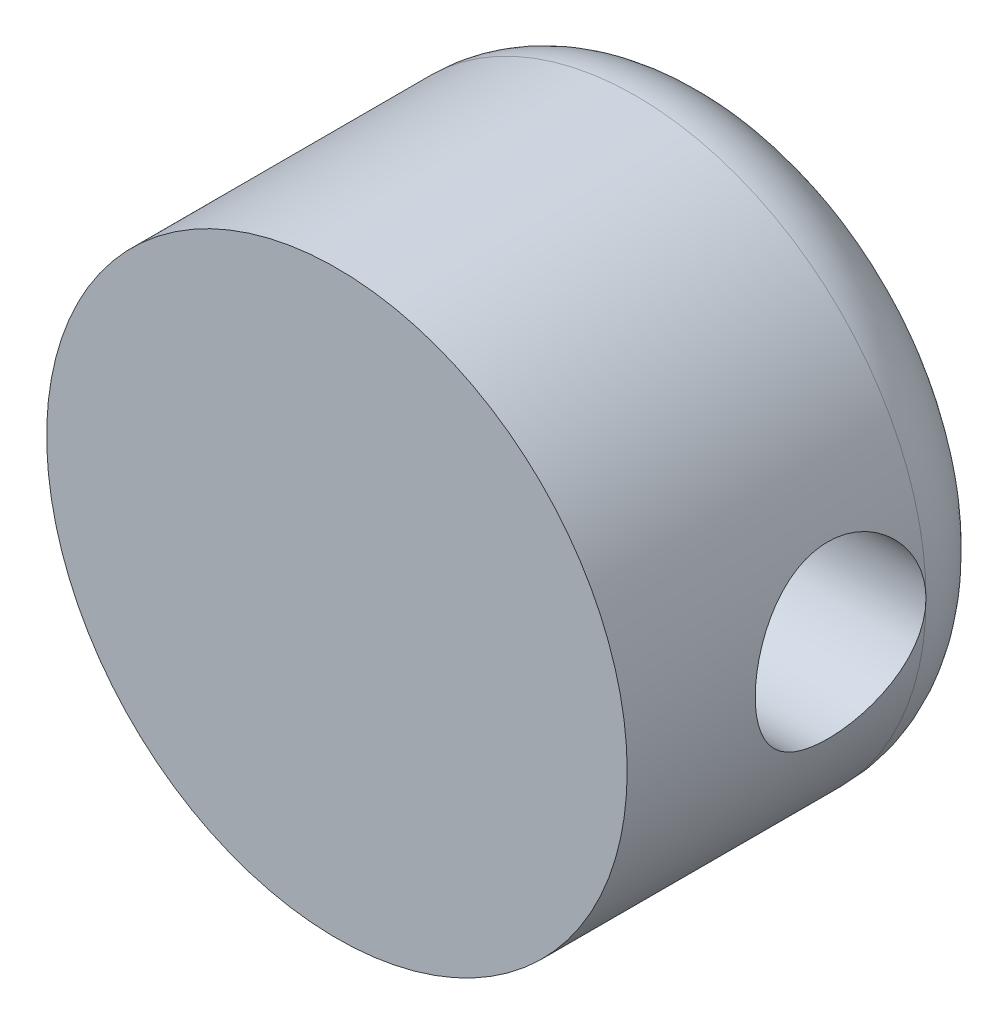
ISO-10303-21;
HEADER;
FILE_DESCRIPTION(('STEP AP214'),'2;1');
FILE_NAME('part.step','',(''),(''),'','','');
FILE_SCHEMA(('AUTOMOTIVE_DESIGN { 1 0 10303 214 1 1 1 1 }'));
ENDSEC;
DATA;
#1=APPLICATION_CONTEXT('core data for automotive mechanical design processes');
#2=APPLICATION_PROTOCOL_DEFINITION('international standard','automotive_design',2000,#1);
#3=PRODUCT_CONTEXT('',#1,'mechanical');
#4=PRODUCT('Part','Part','',(#3));
#5=PRODUCT_RELATED_PRODUCT_CATEGORY('part','',(#4));
#6=PRODUCT_DEFINITION_FORMATION('','',#4);
#7=PRODUCT_DEFINITION_CONTEXT('part definition',#1,'design');
#8=PRODUCT_DEFINITION('design','',#6,#7);
#9=PRODUCT_DEFINITION_SHAPE('','',#8);
#10=(LENGTH_UNIT() NAMED_UNIT(*) SI_UNIT(.MILLI.,.METRE.));
#11=(NAMED_UNIT(*) PLANE_ANGLE_UNIT() SI_UNIT($,.RADIAN.));
#12=(NAMED_UNIT(*) SI_UNIT($,.STERADIAN.) SOLID_ANGLE_UNIT());
#13=UNCERTAINTY_MEASURE_WITH_UNIT(LENGTH_MEASURE(1.E-05),#10,'distance_accuracy_value','');
#14=(GEOMETRIC_REPRESENTATION_CONTEXT(3) GLOBAL_UNCERTAINTY_ASSIGNED_CONTEXT((#13)) GLOBAL_UNIT_ASSIGNED_CONTEXT((#10,
#11,#12)) REPRESENTATION_CONTEXT('',''));
#15=CARTESIAN_POINT('',(0.,0.,0.));
#16=DIRECTION('',(0.,0.,1.));
#17=DIRECTION('',(1.,0.,0.));
#18=AXIS2_PLACEMENT_3D('',#15,#16,#17);
#19=CARTESIAN_POINT('',(0.,0.,4.5));
#20=DIRECTION('',(0.,0.,-1.));
#21=DIRECTION('',(-1.,0.,0.));
#22=AXIS2_PLACEMENT_3D('',#19,#20,#21);
#23=CYLINDRICAL_SURFACE('',#22,3.4);
#24=CARTESIAN_POINT('',(3.4,0.,0.999999999999937));
#25=CARTESIAN_POINT('',(3.39999944793825,-0.0549084350910017,1.00000079621704));
#26=CARTESIAN_POINT('',(3.39865709516379,-0.109824955409747,1.00453743356112));
#27=CARTESIAN_POINT('',(3.39343317236913,-0.218061916103592,1.0225230841441));
#28=CARTESIAN_POINT('',(3.38955076046276,-0.27138182116116,1.03597505233104));
#29=CARTESIAN_POINT('',(3.37967270276685,-0.374848558969666,1.07130566037177));
#30=CARTESIAN_POINT('',(3.37368010469385,-0.424999845560889,1.09317215143625));
#31=CARTESIAN_POINT('',(3.36020643837992,-0.520924055182498,1.14466214286266));
#32=CARTESIAN_POINT('',(3.35272518951837,-0.566696445914832,1.17428658464842));
#33=CARTESIAN_POINT('',(3.3368422425502,-0.653831664465322,1.24131669697409));
#34=CARTESIAN_POINT('',(3.32842223889926,-0.695056011677525,1.27889803829778));
#35=CARTESIAN_POINT('',(3.31172145928358,-0.770717391251898,1.36040055011857));
#36=CARTESIAN_POINT('',(3.30344070585393,-0.80515333452264,1.40432273594838));
#37=CARTESIAN_POINT('',(3.28776355771184,-0.86697912168679,1.4984195769928));
#38=CARTESIAN_POINT('',(3.28038997751753,-0.894201741851443,1.54870826234524));
#39=CARTESIAN_POINT('',(3.26763482618168,-0.939747868564088,1.6534015025126));
#40=CARTESIAN_POINT('',(3.26225279767862,-0.958073418633677,1.70780510887169));
#41=CARTESIAN_POINT('',(3.25428056212142,-0.984809236186611,1.8176325686016));
#42=CARTESIAN_POINT('',(3.25161884443966,-0.993474053057977,1.8729891280917));
#43=CARTESIAN_POINT('',(3.24917568642694,-1.00143709543582,1.98442928009334));
#44=CARTESIAN_POINT('',(3.24939357857435,-1.00073749170578,2.04051270109998));
#45=CARTESIAN_POINT('',(3.25262152846783,-0.990191881694448,2.14976037666178));
#46=CARTESIAN_POINT('',(3.25553486007033,-0.98066270800899,2.20295854261387));
#47=CARTESIAN_POINT('',(3.26366924263737,-0.953239531902652,2.30696510522095));
#48=CARTESIAN_POINT('',(3.26889051336537,-0.935344732892192,2.35777327378899));
#49=CARTESIAN_POINT('',(3.28113108498373,-0.891460422409566,2.45634185826598));
#50=CARTESIAN_POINT('',(3.28817332711273,-0.865366641544147,2.50405288140126));
#51=CARTESIAN_POINT('',(3.30325109309898,-0.805897584158477,2.59452615014648));
#52=CARTESIAN_POINT('',(3.31128684938638,-0.772520602349348,2.63728723318259));
#53=CARTESIAN_POINT('',(3.32784042107488,-0.69785047016579,2.71844634690496));
#54=CARTESIAN_POINT('',(3.33636465282335,-0.656293789776617,2.75660101246982));
#55=CARTESIAN_POINT('',(3.35264886764234,-0.567265821746116,2.82545520557573));
#56=CARTESIAN_POINT('',(3.36040880624525,-0.519794190328363,2.85615429949353));
#57=CARTESIAN_POINT('',(3.37435636425966,-0.419853697513146,2.90936600796153));
#58=CARTESIAN_POINT('',(3.38053389645497,-0.367355571012012,2.93182647809231));
#59=CARTESIAN_POINT('',(3.39054792214316,-0.259103533074759,2.96752841028789));
#60=CARTESIAN_POINT('',(3.39438504225281,-0.20335049748496,2.98077234010284));
#61=CARTESIAN_POINT('',(3.39918758810252,-0.0922416275480392,2.99726435567836));
#62=CARTESIAN_POINT('',(3.40024778409623,-0.0369387996914379,3.00084245395025));
#63=CARTESIAN_POINT('',(3.39965403541036,0.0734798089910702,2.99882370689925));
#64=CARTESIAN_POINT('',(3.39800043765847,0.128595612823294,2.99322803433879));
#65=CARTESIAN_POINT('',(3.39222680910886,0.235842542693713,2.97328822229992));
#66=CARTESIAN_POINT('',(3.38816072392455,0.288012398867972,2.95913530319529));
#67=CARTESIAN_POINT('',(3.37803072686112,0.389227036091268,2.92271132923212));
#68=CARTESIAN_POINT('',(3.37196657839707,0.438271446244119,2.90043931298136));
#69=CARTESIAN_POINT('',(3.3583006705061,0.533069889884204,2.84784484053715));
#70=CARTESIAN_POINT('',(3.35066734707181,0.578724897070212,2.81735231434419));
#71=CARTESIAN_POINT('',(3.33474082731494,0.664383120630004,2.7493903119343));
#72=CARTESIAN_POINT('',(3.32644747219826,0.704384970471128,2.71191915383544));
#73=CARTESIAN_POINT('',(3.30977451160409,0.77904337600622,2.62951437134653));
#74=CARTESIAN_POINT('',(3.3014019519727,0.813465409141697,2.58436639489347));
#75=CARTESIAN_POINT('',(3.2858270712561,0.87425903405288,2.48875345110784));
#76=CARTESIAN_POINT('',(3.27862471490076,0.900630868484143,2.43828864410115));
#77=CARTESIAN_POINT('',(3.26628934882536,0.944389423463174,2.33365708864377));
#78=CARTESIAN_POINT('',(3.26114611745977,0.961820650322727,2.27951022734595));
#79=CARTESIAN_POINT('',(3.25353317018075,0.987269854306408,2.16887153665454));
#80=CARTESIAN_POINT('',(3.25106258296523,0.995290899292681,2.11238047772703));
#81=CARTESIAN_POINT('',(3.24915816303188,1.00148909528149,2.00108649625765));
#82=CARTESIAN_POINT('',(3.24960671260095,1.00004749402701,1.94630653421958));
#83=CARTESIAN_POINT('',(3.25320859627025,0.988266634505211,1.83780709218483));
#84=CARTESIAN_POINT('',(3.25636182978139,0.977927707135612,1.78408757282556));
#85=CARTESIAN_POINT('',(3.2649404562268,0.948887435964955,1.67983056418262));
#86=CARTESIAN_POINT('',(3.27033938611855,0.930283319877281,1.62926365560452));
#87=CARTESIAN_POINT('',(3.28279714202499,0.885316207790427,1.53192864556287));
#88=CARTESIAN_POINT('',(3.28985627597364,0.858951772181853,1.48516125099935));
#89=CARTESIAN_POINT('',(3.30514896268347,0.798126042348224,1.39497418357104));
#90=CARTESIAN_POINT('',(3.31341508717033,0.763412601167795,1.35173008884459));
#91=CARTESIAN_POINT('',(3.33002813097773,0.687332795505097,1.27155723434596));
#92=CARTESIAN_POINT('',(3.33837507046713,0.645964727800162,1.23463009637747));
#93=CARTESIAN_POINT('',(3.35448655680925,0.556368262411132,1.16712158355319));
#94=CARTESIAN_POINT('',(3.36222854662749,0.507981486439979,1.13674448266968));
#95=CARTESIAN_POINT('',(3.37599186667687,0.406559748477462,1.08460031385968));
#96=CARTESIAN_POINT('',(3.38201405843418,0.353527131263158,1.06282893282407));
#97=CARTESIAN_POINT('',(3.39108595421181,0.250755046639444,1.03063289833647));
#98=CARTESIAN_POINT('',(3.39440172048199,0.201360455630109,1.01917583026992));
#99=CARTESIAN_POINT('',(3.39885883215948,0.101312741737706,1.00385959345171));
#100=CARTESIAN_POINT('',(3.40000050934514,0.0506598120796599,0.999999265391339));
#101=CARTESIAN_POINT('',(3.4,0.,0.999999999999937));
#102=B_SPLINE_CURVE_WITH_KNOTS('',3,(#24,#25,#26,#27,#28,#29,#30,#31,#32,#33,#34,#35,#36,#37,
#38,#39,#40,#41,#42,#43,#44,#45,#46,#47,#48,#49,#50,#51,#52,#53,#54,#55,#56,#57,#58,#59,#60,#61,
#62,#63,#64,#65,#66,#67,#68,#69,#70,#71,#72,#73,#74,#75,#76,#77,#78,#79,#80,#81,#82,#83,#84,#85,
#86,#87,#88,#89,#90,#91,#92,#93,#94,#95,#96,#97,#98,#99,#100,#101),.UNSPECIFIED.,.T.,.F.,(4,2,2,
2,2,2,2,2,2,2,2,2,2,2,2,2,2,2,2,2,2,2,2,2,2,2,2,2,2,2,2,2,2,2,2,2,2,2,4),(0.,0.164539276837859,
0.329133116802855,0.493490204352204,0.657867245809793,0.826344722923748,0.994849207610315,
1.16697287413944,1.33905698775671,1.50649104970806,1.67388629949289,1.8354982387619,
1.99712557013999,2.16089777481423,2.32470836634098,2.49508032903625,2.66546219835764,
2.83690457503798,3.00830102994222,3.17376695211197,3.33921172299186,3.50108946098714,
3.66298637335274,3.82853079749371,3.99411517034147,4.16546315198126,4.33680596820236,
4.50728735409603,4.67771314501129,4.84131587293154,5.00491251661588,5.1666336466097,
5.32838479626237,5.49582451023558,5.66330714806039,5.83543229814639,6.00747107094443,
6.15930204510608,6.31110984714079),.UNSPECIFIED.);
#103=CARTESIAN_POINT('',(3.4,0.,0.999999999999937));
#104=VERTEX_POINT('',#103);
#105=EDGE_CURVE('E64',#104,#104,#102,.T.);
#106=ORIENTED_EDGE('',*,*,#105,.T.);
#107=CARTESIAN_POINT('',(0.,0.,1.));
#108=DIRECTION('',(0.,0.,1.));
#109=DIRECTION('',(1.,0.,0.));
#110=AXIS2_PLACEMENT_3D('',#107,#108,#109);
#111=CIRCLE('',#110,3.4);
#112=CARTESIAN_POINT('',(-3.4,0.,0.999999999999937));
#113=VERTEX_POINT('',#112);
#114=EDGE_CURVE('E47',#104,#113,#111,.T.);
#115=ORIENTED_EDGE('',*,*,#114,.T.);
#116=CARTESIAN_POINT('',(-3.4,0.,2.99999999999994));
#117=CARTESIAN_POINT('',(-3.39999944793825,-0.0549084350909983,2.99999920378284));
#118=CARTESIAN_POINT('',(-3.39865709516379,-0.109824955409744,2.99546256643875));
#119=CARTESIAN_POINT('',(-3.39343317236914,-0.218061916103588,2.97747691585577));
#120=CARTESIAN_POINT('',(-3.38955076046276,-0.271381821161156,2.96402494766883));
#121=CARTESIAN_POINT('',(-3.37967270276685,-0.374848558969663,2.92869433962811));
#122=CARTESIAN_POINT('',(-3.37368010469385,-0.424999845560886,2.90682784856363));
#123=CARTESIAN_POINT('',(-3.36020643837992,-0.520924055182495,2.85533785713722));
#124=CARTESIAN_POINT('',(-3.35272518951837,-0.56669644591483,2.82571341535146));
#125=CARTESIAN_POINT('',(-3.3368422425502,-0.653831664465319,2.75868330302578));
#126=CARTESIAN_POINT('',(-3.32842223889926,-0.695056011677523,2.7211019617021));
#127=CARTESIAN_POINT('',(-3.31172145928358,-0.770717391251896,2.63959944988131));
#128=CARTESIAN_POINT('',(-3.30344070585393,-0.805153334522638,2.5956772640515));
#129=CARTESIAN_POINT('',(-3.28776355771184,-0.866979121686788,2.50158042300708));
#130=CARTESIAN_POINT('',(-3.28038997751753,-0.894201741851441,2.45129173765464));
#131=CARTESIAN_POINT('',(-3.26763482618168,-0.939747868564087,2.34659849748728));
#132=CARTESIAN_POINT('',(-3.26225279767862,-0.958073418633676,2.29219489112819));
#133=CARTESIAN_POINT('',(-3.25428056212142,-0.984809236186611,2.18236743139828));
#134=CARTESIAN_POINT('',(-3.25161884443966,-0.993474053057976,2.12701087190818));
#135=CARTESIAN_POINT('',(-3.24917568642694,-1.00143709543582,2.01557071990653));
#136=CARTESIAN_POINT('',(-3.24939357857435,-1.00073749170578,1.9594872988999));
#137=CARTESIAN_POINT('',(-3.25262152846783,-0.990191881694449,1.8502396233381));
#138=CARTESIAN_POINT('',(-3.25553486007033,-0.980662708008991,1.79704145738601));
#139=CARTESIAN_POINT('',(-3.26366924263737,-0.953239531902653,1.69303489477892));
#140=CARTESIAN_POINT('',(-3.26889051336537,-0.935344732892193,1.64222672621089));
#141=CARTESIAN_POINT('',(-3.28113108498373,-0.891460422409568,1.5436581417339));
#142=CARTESIAN_POINT('',(-3.28817332711273,-0.865366641544149,1.49594711859861));
#143=CARTESIAN_POINT('',(-3.30325109309898,-0.805897584158479,1.4054738498534));
#144=CARTESIAN_POINT('',(-3.31128684938638,-0.77252060234935,1.36271276681729));
#145=CARTESIAN_POINT('',(-3.32784042107488,-0.697850470165792,1.28155365309492));
#146=CARTESIAN_POINT('',(-3.33636465282334,-0.65629378977662,1.24339898753006));
#147=CARTESIAN_POINT('',(-3.35264886764234,-0.567265821746119,1.17454479442415));
#148=CARTESIAN_POINT('',(-3.36040880624525,-0.519794190328366,1.14384570050634));
#149=CARTESIAN_POINT('',(-3.37435636425966,-0.41985369751315,1.09063399203835));
#150=CARTESIAN_POINT('',(-3.38053389645497,-0.367355571012016,1.06817352190757));
#151=CARTESIAN_POINT('',(-3.39054792214316,-0.259103533074762,1.03247158971199));
#152=CARTESIAN_POINT('',(-3.39438504225281,-0.203350497484963,1.01922765989703));
#153=CARTESIAN_POINT('',(-3.39918758810252,-0.0922416275480428,1.00273564432152));
#154=CARTESIAN_POINT('',(-3.40024778409623,-0.0369387996914416,0.999157546049627));
#155=CARTESIAN_POINT('',(-3.39965403541036,0.0734798089910665,1.00117629310062));
#156=CARTESIAN_POINT('',(-3.39800043765847,0.12859561282329,1.00677196566108));
#157=CARTESIAN_POINT('',(-3.39222680910886,0.23584254269371,1.02671177769996));
#158=CARTESIAN_POINT('',(-3.38816072392455,0.288012398867968,1.04086469680459));
#159=CARTESIAN_POINT('',(-3.37803072686112,0.389227036091265,1.07728867076776));
#160=CARTESIAN_POINT('',(-3.37196657839707,0.438271446244116,1.09956068701852));
#161=CARTESIAN_POINT('',(-3.3583006705061,0.533069889884201,1.15215515946273));
#162=CARTESIAN_POINT('',(-3.35066734707181,0.578724897070209,1.18264768565568));
#163=CARTESIAN_POINT('',(-3.33474082731494,0.664383120630002,1.25060968806558));
#164=CARTESIAN_POINT('',(-3.32644747219826,0.704384970471126,1.28808084616443));
#165=CARTESIAN_POINT('',(-3.30977451160409,0.779043376006217,1.37048562865334));
#166=CARTESIAN_POINT('',(-3.3014019519727,0.813465409141695,1.4156336051064));
#167=CARTESIAN_POINT('',(-3.2858270712561,0.874259034052878,1.51124654889203));
#168=CARTESIAN_POINT('',(-3.27862471490076,0.900630868484141,1.56171135589872));
#169=CARTESIAN_POINT('',(-3.26628934882536,0.944389423463173,1.6663429113561));
#170=CARTESIAN_POINT('',(-3.26114611745977,0.961820650322726,1.72048977265392));
#171=CARTESIAN_POINT('',(-3.25353317018075,0.987269854306407,1.83112846334533));
#172=CARTESIAN_POINT('',(-3.25106258296523,0.99529089929268,1.88761952227284));
#173=CARTESIAN_POINT('',(-3.24915816303188,1.00148909528149,1.99891350374222));
#174=CARTESIAN_POINT('',(-3.24960671260095,1.00004749402701,2.0536934657803));
#175=CARTESIAN_POINT('',(-3.25320859627025,0.988266634505212,2.16219290781505));
#176=CARTESIAN_POINT('',(-3.25636182978139,0.977927707135613,2.21591242717431));
#177=CARTESIAN_POINT('',(-3.2649404562268,0.948887435964956,2.32016943581725));
#178=CARTESIAN_POINT('',(-3.27033938611855,0.930283319877283,2.37073634439535));
#179=CARTESIAN_POINT('',(-3.28279714202499,0.885316207790428,2.46807135443701));
#180=CARTESIAN_POINT('',(-3.28985627597364,0.858951772181854,2.51483874900052));
#181=CARTESIAN_POINT('',(-3.30514896268347,0.798126042348227,2.60502581642884));
#182=CARTESIAN_POINT('',(-3.31341508717033,0.763412601167797,2.64826991115528));
#183=CARTESIAN_POINT('',(-3.33002813097773,0.6873327955051,2.72844276565391));
#184=CARTESIAN_POINT('',(-3.33837507046713,0.645964727800165,2.7653699036224));
#185=CARTESIAN_POINT('',(-3.35448655680925,0.556368262411135,2.83287841644668));
#186=CARTESIAN_POINT('',(-3.36222854662749,0.507981486439982,2.86325551733019));
#187=CARTESIAN_POINT('',(-3.37599186667687,0.406559748477465,2.9153996861402));
#188=CARTESIAN_POINT('',(-3.38201405843418,0.353527131263162,2.9371710671758));
#189=CARTESIAN_POINT('',(-3.39108595421181,0.250755046639448,2.96936710166341));
#190=CARTESIAN_POINT('',(-3.39440172048199,0.201360455630113,2.98082416972995));
#191=CARTESIAN_POINT('',(-3.39885883215948,0.10131274173771,2.99614040654816));
#192=CARTESIAN_POINT('',(-3.40000050934514,0.0506598120796635,3.00000073460854));
#193=CARTESIAN_POINT('',(-3.4,0.,2.99999999999994));
#194=B_SPLINE_CURVE_WITH_KNOTS('',3,(#116,#117,#118,#119,#120,#121,#122,#123,#124,#125,#126,
#127,#128,#129,#130,#131,#132,#133,#134,#135,#136,#137,#138,#139,#140,#141,#142,#143,#144,#145,
#146,#147,#148,#149,#150,#151,#152,#153,#154,#155,#156,#157,#158,#159,#160,#161,#162,#163,#164,
#165,#166,#167,#168,#169,#170,#171,#172,#173,#174,#175,#176,#177,#178,#179,#180,#181,#182,#183,
#184,#185,#186,#187,#188,#189,#190,#191,#192,#193),.UNSPECIFIED.,.T.,.F.,(4,2,2,2,2,2,2,2,2,2,2,
2,2,2,2,2,2,2,2,2,2,2,2,2,2,2,2,2,2,2,2,2,2,2,2,2,2,2,4),(0.,0.164539276837859,
0.329133116802855,0.493490204352204,0.657867245809793,0.826344722923747,0.994849207610315,
1.16697287413944,1.33905698775671,1.50649104970806,1.67388629949289,1.8354982387619,
1.99712557013999,2.16089777481423,2.32470836634098,2.49508032903625,2.66546219835764,
2.83690457503798,3.00830102994222,3.17376695211197,3.33921172299186,3.50108946098714,
3.66298637335273,3.82853079749371,3.99411517034147,4.16546315198125,4.33680596820236,
4.50728735409603,4.67771314501129,4.84131587293153,5.00491251661588,5.1666336466097,
5.32838479626237,5.49582451023557,5.66330714806039,5.83543229814639,6.00747107094443,
6.15930204510608,6.31110984714078),.UNSPECIFIED.);
#195=EDGE_CURVE('E62',#113,#113,#194,.T.);
#196=ORIENTED_EDGE('',*,*,#195,.T.);
#197=CARTESIAN_POINT('',(0.,0.,1.));
#198=DIRECTION('',(0.,0.,1.));
#199=DIRECTION('',(1.,0.,0.));
#200=AXIS2_PLACEMENT_3D('',#197,#198,#199);
#201=CIRCLE('',#200,3.4);
#202=EDGE_CURVE('E54',#113,#104,#201,.T.);
#203=ORIENTED_EDGE('',*,*,#202,.T.);
#204=EDGE_LOOP('',(#106,#115,#196,#203));
#205=FACE_BOUND('',#204,.T.);
#206=CARTESIAN_POINT('',(0.,0.,4.5));
#207=DIRECTION('',(0.,0.,1.));
#208=DIRECTION('',(1.,0.,0.));
#209=AXIS2_PLACEMENT_3D('',#206,#207,#208);
#210=CIRCLE('',#209,3.4);
#211=CARTESIAN_POINT('',(3.4,0.,4.5));
#212=VERTEX_POINT('',#211);
#213=EDGE_CURVE('E58',#212,#212,#210,.T.);
#214=ORIENTED_EDGE('',*,*,#213,.F.);
#215=EDGE_LOOP('',(#214));
#216=FACE_BOUND('',#215,.T.);
#217=ADVANCED_FACE('F39',(#205,#216),#23,.T.);
#218=CARTESIAN_POINT('',(0.,0.,4.5));
#219=DIRECTION('',(0.,0.,1.));
#220=DIRECTION('',(1.,0.,0.));
#221=AXIS2_PLACEMENT_3D('',#218,#219,#220);
#222=PLANE('',#221);
#223=ORIENTED_EDGE('',*,*,#213,.T.);
#224=EDGE_LOOP('',(#223));
#225=FACE_BOUND('',#224,.T.);
#226=ADVANCED_FACE('F83',(#225),#222,.T.);
#227=CARTESIAN_POINT('',(0.,0.,0.));
#228=DIRECTION('',(0.,0.,1.));
#229=DIRECTION('',(1.,0.,0.));
#230=AXIS2_PLACEMENT_3D('',#227,#228,#229);
#231=PLANE('',#230);
#232=CARTESIAN_POINT('',(0.,0.,0.));
#233=DIRECTION('',(0.,0.,1.));
#234=DIRECTION('',(1.,0.,0.));
#235=AXIS2_PLACEMENT_3D('',#232,#233,#234);
#236=CIRCLE('',#235,2.4);
#237=CARTESIAN_POINT('',(2.4,0.,0.));
#238=VERTEX_POINT('',#237);
#239=EDGE_CURVE('E11',#238,#238,#236,.F.);
#240=ORIENTED_EDGE('',*,*,#239,.T.);
#241=EDGE_LOOP('',(#240));
#242=FACE_BOUND('',#241,.T.);
#243=ADVANCED_FACE('F81',(#242),#231,.F.);
#244=CARTESIAN_POINT('',(-6.00000000000001,0.,1.99999999999994));
#245=DIRECTION('',(1.,0.,0.));
#246=DIRECTION('',(0.,0.,-1.));
#247=AXIS2_PLACEMENT_3D('',#244,#245,#246);
#248=CYLINDRICAL_SURFACE('',#247,1.);
#249=ORIENTED_EDGE('',*,*,#105,.F.);
#250=EDGE_LOOP('',(#249));
#251=FACE_BOUND('',#250,.T.);
#252=ORIENTED_EDGE('',*,*,#195,.F.);
#253=EDGE_LOOP('',(#252));
#254=FACE_BOUND('',#253,.T.);
#255=ADVANCED_FACE('F77',(#251,#254),#248,.F.);
#256=CARTESIAN_POINT('',(0.,0.,1.));
#257=DIRECTION('',(0.,0.,1.));
#258=DIRECTION('',(1.,0.,0.));
#259=AXIS2_PLACEMENT_3D('',#256,#257,#258);
#260=TOROIDAL_SURFACE('',#259,2.4,1.);
#261=ORIENTED_EDGE('',*,*,#239,.F.);
#262=EDGE_LOOP('',(#261));
#263=FACE_BOUND('',#262,.T.);
#264=ORIENTED_EDGE('',*,*,#202,.F.);
#265=ORIENTED_EDGE('',*,*,#114,.F.);
#266=EDGE_LOOP('',(#264,#265));
#267=FACE_BOUND('',#266,.T.);
#268=ADVANCED_FACE('F41',(#263,#267),#260,.T.);
#269=CLOSED_SHELL('',(#217,#226,#243,#255,#268));
#270=MANIFOLD_SOLID_BREP('B2',#269);
#271=ADVANCED_BREP_SHAPE_REPRESENTATION('',(#18,#270),#14);
#272=SHAPE_DEFINITION_REPRESENTATION(#9,#271);
ENDSEC;
END-ISO-10303-21;
